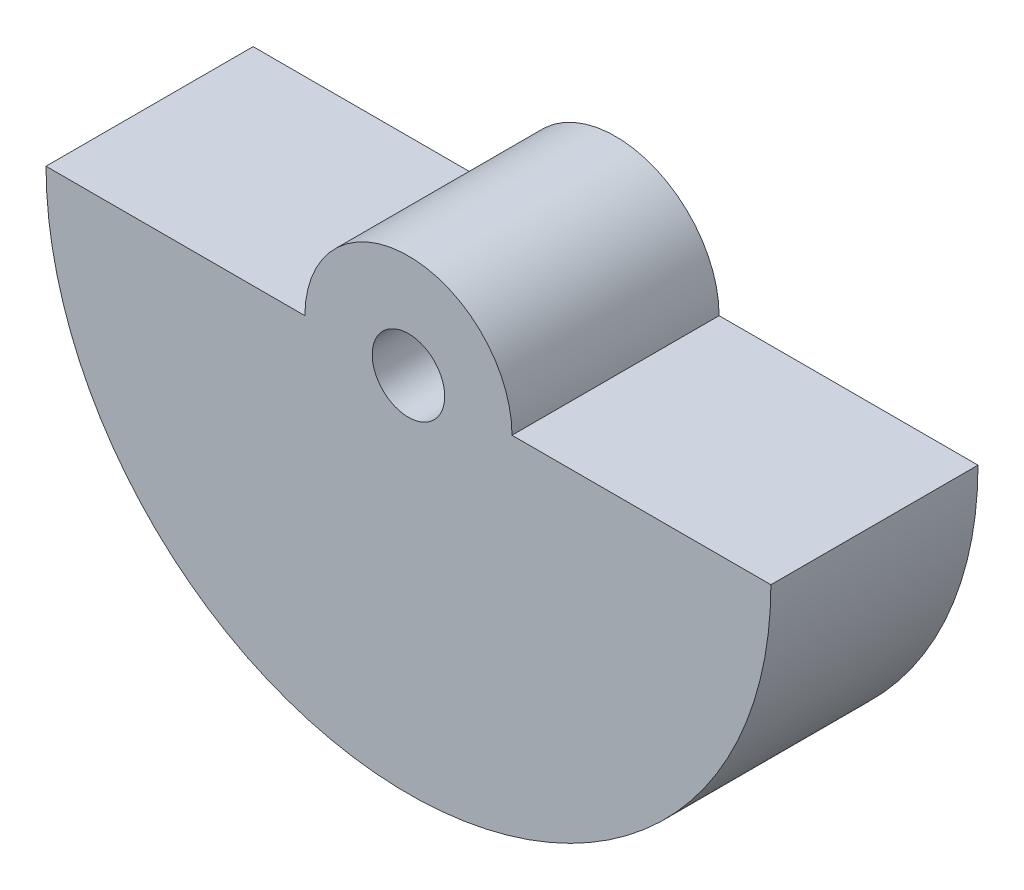
ISO-10303-21;
HEADER;
FILE_DESCRIPTION(('STEP AP214'),'2;1');
FILE_NAME('part.step','',(''),(''),'','','');
FILE_SCHEMA(('AUTOMOTIVE_DESIGN { 1 0 10303 214 1 1 1 1 }'));
ENDSEC;
DATA;
#1=APPLICATION_CONTEXT('core data for automotive mechanical design processes');
#2=APPLICATION_PROTOCOL_DEFINITION('international standard','automotive_design',2000,#1);
#3=PRODUCT_CONTEXT('',#1,'mechanical');
#4=PRODUCT('Part','Part','',(#3));
#5=PRODUCT_RELATED_PRODUCT_CATEGORY('part','',(#4));
#6=PRODUCT_DEFINITION_FORMATION('','',#4);
#7=PRODUCT_DEFINITION_CONTEXT('part definition',#1,'design');
#8=PRODUCT_DEFINITION('design','',#6,#7);
#9=PRODUCT_DEFINITION_SHAPE('','',#8);
#10=(LENGTH_UNIT() NAMED_UNIT(*) SI_UNIT(.MILLI.,.METRE.));
#11=(NAMED_UNIT(*) PLANE_ANGLE_UNIT() SI_UNIT($,.RADIAN.));
#12=(NAMED_UNIT(*) SI_UNIT($,.STERADIAN.) SOLID_ANGLE_UNIT());
#13=UNCERTAINTY_MEASURE_WITH_UNIT(LENGTH_MEASURE(1.E-05),#10,'distance_accuracy_value','');
#14=(GEOMETRIC_REPRESENTATION_CONTEXT(3) GLOBAL_UNCERTAINTY_ASSIGNED_CONTEXT((#13)) GLOBAL_UNIT_ASSIGNED_CONTEXT((#10,
#11,#12)) REPRESENTATION_CONTEXT('',''));
#15=CARTESIAN_POINT('',(0.,0.,0.));
#16=DIRECTION('',(0.,0.,1.));
#17=DIRECTION('',(1.,0.,0.));
#18=AXIS2_PLACEMENT_3D('',#15,#16,#17);
#19=CARTESIAN_POINT('',(0.,0.,20.));
#20=DIRECTION('',(0.,0.,1.));
#21=DIRECTION('',(1.,0.,0.));
#22=AXIS2_PLACEMENT_3D('',#19,#20,#21);
#23=PLANE('',#22);
#24=CARTESIAN_POINT('',(0.,0.,20.));
#25=DIRECTION('',(0.,0.,1.));
#26=DIRECTION('',(1.,0.,0.));
#27=AXIS2_PLACEMENT_3D('',#24,#25,#26);
#28=CIRCLE('',#27,35.);
#29=CARTESIAN_POINT('',(-35.,0.,20.));
#30=VERTEX_POINT('',#29);
#31=CARTESIAN_POINT('',(35.,0.,20.));
#32=VERTEX_POINT('',#31);
#33=EDGE_CURVE('E98',#30,#32,#28,.T.);
#34=ORIENTED_EDGE('',*,*,#33,.T.);
#35=DIRECTION('',(-1.,0.,0.));
#36=VECTOR('',#35,1.);
#37=CARTESIAN_POINT('',(10.,0.,20.));
#38=LINE('',#37,#36);
#39=CARTESIAN_POINT('',(10.,0.,20.));
#40=VERTEX_POINT('',#39);
#41=EDGE_CURVE('E93',#32,#40,#38,.T.);
#42=ORIENTED_EDGE('',*,*,#41,.T.);
#43=CARTESIAN_POINT('',(0.,0.,20.));
#44=DIRECTION('',(0.,0.,1.));
#45=DIRECTION('',(1.,0.,0.));
#46=AXIS2_PLACEMENT_3D('',#43,#44,#45);
#47=CIRCLE('',#46,10.);
#48=CARTESIAN_POINT('',(-10.,0.,20.));
#49=VERTEX_POINT('',#48);
#50=EDGE_CURVE('E96',#40,#49,#47,.T.);
#51=ORIENTED_EDGE('',*,*,#50,.T.);
#52=DIRECTION('',(-1.,0.,0.));
#53=VECTOR('',#52,1.);
#54=CARTESIAN_POINT('',(-35.,0.,20.));
#55=LINE('',#54,#53);
#56=EDGE_CURVE('E63',#49,#30,#55,.T.);
#57=ORIENTED_EDGE('',*,*,#56,.T.);
#58=EDGE_LOOP('',(#34,#42,#51,#57));
#59=FACE_BOUND('',#58,.T.);
#60=CARTESIAN_POINT('',(0.,0.,20.));
#61=DIRECTION('',(0.,0.,1.));
#62=DIRECTION('',(1.,0.,0.));
#63=AXIS2_PLACEMENT_3D('',#60,#61,#62);
#64=CIRCLE('',#63,3.5);
#65=CARTESIAN_POINT('',(3.5,0.,20.));
#66=VERTEX_POINT('',#65);
#67=EDGE_CURVE('E118',#66,#66,#64,.T.);
#68=ORIENTED_EDGE('',*,*,#67,.F.);
#69=EDGE_LOOP('',(#68));
#70=FACE_BOUND('',#69,.T.);
#71=ADVANCED_FACE('F45',(#59,#70),#23,.T.);
#72=CARTESIAN_POINT('',(0.,0.,0.));
#73=DIRECTION('',(0.,0.,1.));
#74=DIRECTION('',(1.,0.,0.));
#75=AXIS2_PLACEMENT_3D('',#72,#73,#74);
#76=PLANE('',#75);
#77=CARTESIAN_POINT('',(0.,0.,0.));
#78=DIRECTION('',(0.,0.,1.));
#79=DIRECTION('',(1.,0.,0.));
#80=AXIS2_PLACEMENT_3D('',#77,#78,#79);
#81=CIRCLE('',#80,35.);
#82=CARTESIAN_POINT('',(-35.,0.,0.));
#83=VERTEX_POINT('',#82);
#84=CARTESIAN_POINT('',(35.,0.,0.));
#85=VERTEX_POINT('',#84);
#86=EDGE_CURVE('E114',#83,#85,#81,.T.);
#87=ORIENTED_EDGE('',*,*,#86,.F.);
#88=DIRECTION('',(-1.,0.,0.));
#89=VECTOR('',#88,1.);
#90=CARTESIAN_POINT('',(-35.,0.,0.));
#91=LINE('',#90,#89);
#92=CARTESIAN_POINT('',(-10.,0.,0.));
#93=VERTEX_POINT('',#92);
#94=EDGE_CURVE('E86',#93,#83,#91,.T.);
#95=ORIENTED_EDGE('',*,*,#94,.F.);
#96=CARTESIAN_POINT('',(0.,0.,0.));
#97=DIRECTION('',(0.,0.,1.));
#98=DIRECTION('',(1.,0.,0.));
#99=AXIS2_PLACEMENT_3D('',#96,#97,#98);
#100=CIRCLE('',#99,10.);
#101=CARTESIAN_POINT('',(10.,0.,0.));
#102=VERTEX_POINT('',#101);
#103=EDGE_CURVE('E80',#102,#93,#100,.T.);
#104=ORIENTED_EDGE('',*,*,#103,.F.);
#105=DIRECTION('',(-1.,0.,0.));
#106=VECTOR('',#105,1.);
#107=CARTESIAN_POINT('',(10.,0.,0.));
#108=LINE('',#107,#106);
#109=EDGE_CURVE('E103',#85,#102,#108,.T.);
#110=ORIENTED_EDGE('',*,*,#109,.F.);
#111=EDGE_LOOP('',(#87,#95,#104,#110));
#112=FACE_BOUND('',#111,.T.);
#113=CARTESIAN_POINT('',(0.,0.,0.));
#114=DIRECTION('',(0.,0.,1.));
#115=DIRECTION('',(1.,0.,0.));
#116=AXIS2_PLACEMENT_3D('',#113,#114,#115);
#117=CIRCLE('',#116,3.5);
#118=CARTESIAN_POINT('',(3.5,0.,0.));
#119=VERTEX_POINT('',#118);
#120=EDGE_CURVE('E136',#119,#119,#117,.T.);
#121=ORIENTED_EDGE('',*,*,#120,.T.);
#122=EDGE_LOOP('',(#121));
#123=FACE_BOUND('',#122,.T.);
#124=ADVANCED_FACE('F131',(#112,#123),#76,.F.);
#125=CARTESIAN_POINT('',(0.,0.,20.));
#126=DIRECTION('',(0.,0.,-1.));
#127=DIRECTION('',(-1.,0.,0.));
#128=AXIS2_PLACEMENT_3D('',#125,#126,#127);
#129=CYLINDRICAL_SURFACE('',#128,35.);
#130=ORIENTED_EDGE('',*,*,#86,.T.);
#131=DIRECTION('',(0.,0.,-1.));
#132=VECTOR('',#131,1.);
#133=CARTESIAN_POINT('',(35.,0.,20.));
#134=LINE('',#133,#132);
#135=EDGE_CURVE('E11',#32,#85,#134,.T.);
#136=ORIENTED_EDGE('',*,*,#135,.F.);
#137=ORIENTED_EDGE('',*,*,#33,.F.);
#138=DIRECTION('',(0.,0.,-1.));
#139=VECTOR('',#138,1.);
#140=CARTESIAN_POINT('',(-35.,0.,20.));
#141=LINE('',#140,#139);
#142=EDGE_CURVE('E110',#30,#83,#141,.T.);
#143=ORIENTED_EDGE('',*,*,#142,.T.);
#144=EDGE_LOOP('',(#130,#136,#137,#143));
#145=FACE_BOUND('',#144,.T.);
#146=ADVANCED_FACE('F47',(#145),#129,.T.);
#147=CARTESIAN_POINT('',(10.,0.,20.));
#148=DIRECTION('',(0.,-1.,0.));
#149=DIRECTION('',(0.,0.,-1.));
#150=AXIS2_PLACEMENT_3D('',#147,#148,#149);
#151=PLANE('',#150);
#152=ORIENTED_EDGE('',*,*,#109,.T.);
#153=DIRECTION('',(0.,0.,-1.));
#154=VECTOR('',#153,1.);
#155=CARTESIAN_POINT('',(10.,0.,20.));
#156=LINE('',#155,#154);
#157=EDGE_CURVE('E55',#40,#102,#156,.T.);
#158=ORIENTED_EDGE('',*,*,#157,.F.);
#159=ORIENTED_EDGE('',*,*,#41,.F.);
#160=ORIENTED_EDGE('',*,*,#135,.T.);
#161=EDGE_LOOP('',(#152,#158,#159,#160));
#162=FACE_BOUND('',#161,.T.);
#163=ADVANCED_FACE('F102',(#162),#151,.F.);
#164=CARTESIAN_POINT('',(0.,0.,20.));
#165=DIRECTION('',(0.,0.,-1.));
#166=DIRECTION('',(-1.,0.,0.));
#167=AXIS2_PLACEMENT_3D('',#164,#165,#166);
#168=CYLINDRICAL_SURFACE('',#167,10.);
#169=ORIENTED_EDGE('',*,*,#103,.T.);
#170=DIRECTION('',(0.,0.,-1.));
#171=VECTOR('',#170,1.);
#172=CARTESIAN_POINT('',(-10.,0.,20.));
#173=LINE('',#172,#171);
#174=EDGE_CURVE('E105',#49,#93,#173,.T.);
#175=ORIENTED_EDGE('',*,*,#174,.F.);
#176=ORIENTED_EDGE('',*,*,#50,.F.);
#177=ORIENTED_EDGE('',*,*,#157,.T.);
#178=EDGE_LOOP('',(#169,#175,#176,#177));
#179=FACE_BOUND('',#178,.T.);
#180=ADVANCED_FACE('F106',(#179),#168,.T.);
#181=CARTESIAN_POINT('',(-35.,0.,20.));
#182=DIRECTION('',(0.,-1.,0.));
#183=DIRECTION('',(0.,0.,-1.));
#184=AXIS2_PLACEMENT_3D('',#181,#182,#183);
#185=PLANE('',#184);
#186=ORIENTED_EDGE('',*,*,#94,.T.);
#187=ORIENTED_EDGE('',*,*,#142,.F.);
#188=ORIENTED_EDGE('',*,*,#56,.F.);
#189=ORIENTED_EDGE('',*,*,#174,.T.);
#190=EDGE_LOOP('',(#186,#187,#188,#189));
#191=FACE_BOUND('',#190,.T.);
#192=ADVANCED_FACE('F128',(#191),#185,.F.);
#193=CARTESIAN_POINT('',(0.,0.,20.));
#194=DIRECTION('',(0.,0.,-1.));
#195=DIRECTION('',(-1.,0.,0.));
#196=AXIS2_PLACEMENT_3D('',#193,#194,#195);
#197=CYLINDRICAL_SURFACE('',#196,3.5);
#198=ORIENTED_EDGE('',*,*,#67,.T.);
#199=EDGE_LOOP('',(#198));
#200=FACE_BOUND('',#199,.T.);
#201=ORIENTED_EDGE('',*,*,#120,.F.);
#202=EDGE_LOOP('',(#201));
#203=FACE_BOUND('',#202,.T.);
#204=ADVANCED_FACE('F144',(#200,#203),#197,.F.);
#205=CLOSED_SHELL('',(#71,#124,#146,#163,#180,#192,#204));
#206=MANIFOLD_SOLID_BREP('B2',#205);
#207=ADVANCED_BREP_SHAPE_REPRESENTATION('',(#18,#206),#14);
#208=SHAPE_DEFINITION_REPRESENTATION(#9,#207);
ENDSEC;
END-ISO-10303-21;
